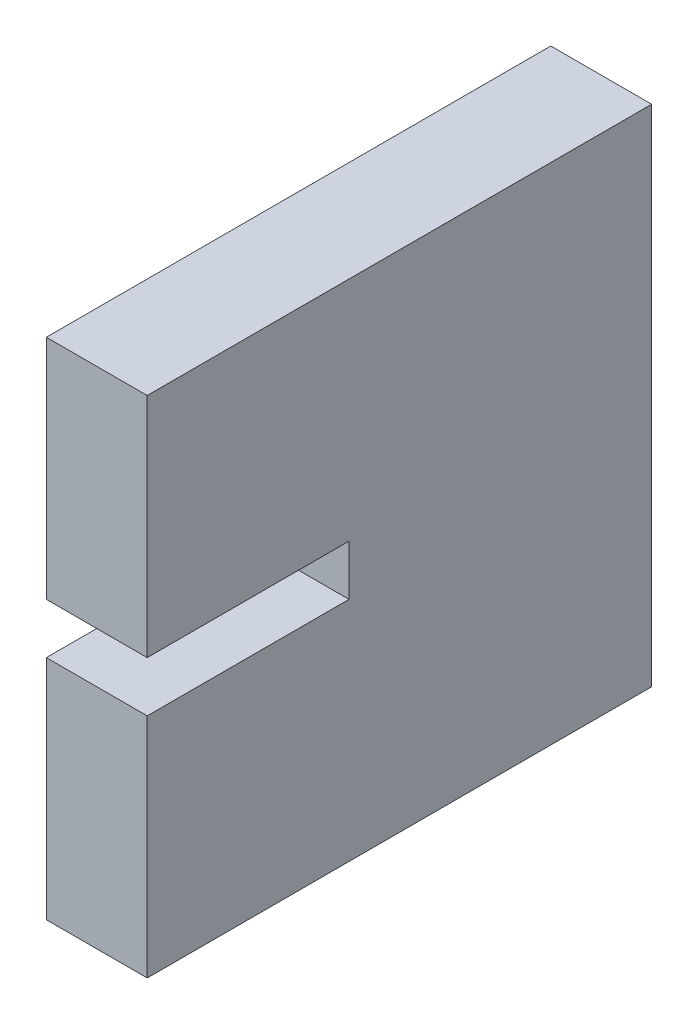
ISO-10303-21;
HEADER;
FILE_DESCRIPTION(('STEP AP214'),'2;1');
FILE_NAME('part.step','',(''),(''),'','','');
FILE_SCHEMA(('AUTOMOTIVE_DESIGN { 1 0 10303 214 1 1 1 1 }'));
ENDSEC;
DATA;
#1=APPLICATION_CONTEXT('core data for automotive mechanical design processes');
#2=APPLICATION_PROTOCOL_DEFINITION('international standard','automotive_design',2000,#1);
#3=PRODUCT_CONTEXT('',#1,'mechanical');
#4=PRODUCT('Part','Part','',(#3));
#5=PRODUCT_RELATED_PRODUCT_CATEGORY('part','',(#4));
#6=PRODUCT_DEFINITION_FORMATION('','',#4);
#7=PRODUCT_DEFINITION_CONTEXT('part definition',#1,'design');
#8=PRODUCT_DEFINITION('design','',#6,#7);
#9=PRODUCT_DEFINITION_SHAPE('','',#8);
#10=(LENGTH_UNIT() NAMED_UNIT(*) SI_UNIT(.MILLI.,.METRE.));
#11=(NAMED_UNIT(*) PLANE_ANGLE_UNIT() SI_UNIT($,.RADIAN.));
#12=(NAMED_UNIT(*) SI_UNIT($,.STERADIAN.) SOLID_ANGLE_UNIT());
#13=UNCERTAINTY_MEASURE_WITH_UNIT(LENGTH_MEASURE(1.E-05),#10,'distance_accuracy_value','');
#14=(GEOMETRIC_REPRESENTATION_CONTEXT(3) GLOBAL_UNCERTAINTY_ASSIGNED_CONTEXT((#13)) GLOBAL_UNIT_ASSIGNED_CONTEXT((#10,
#11,#12)) REPRESENTATION_CONTEXT('',''));
#15=CARTESIAN_POINT('',(0.,0.,0.));
#16=DIRECTION('',(0.,0.,1.));
#17=DIRECTION('',(1.,0.,0.));
#18=AXIS2_PLACEMENT_3D('',#15,#16,#17);
#19=CARTESIAN_POINT('',(20.,50.,50.));
#20=DIRECTION('',(0.,0.,-1.));
#21=DIRECTION('',(0.,1.,0.));
#22=AXIS2_PLACEMENT_3D('',#19,#20,#21);
#23=PLANE('',#22);
#24=DIRECTION('',(0.,-1.,0.));
#25=VECTOR('',#24,1.);
#26=CARTESIAN_POINT('',(0.,50.,50.));
#27=LINE('',#26,#25);
#28=CARTESIAN_POINT('',(0.,50.,50.));
#29=VERTEX_POINT('',#28);
#30=CARTESIAN_POINT('',(0.,5.,50.));
#31=VERTEX_POINT('',#30);
#32=EDGE_CURVE('E144',#29,#31,#27,.T.);
#33=ORIENTED_EDGE('',*,*,#32,.T.);
#34=DIRECTION('',(-1.,0.,0.));
#35=VECTOR('',#34,1.);
#36=CARTESIAN_POINT('',(20.,5.,50.));
#37=LINE('',#36,#35);
#38=CARTESIAN_POINT('',(20.,5.,50.));
#39=VERTEX_POINT('',#38);
#40=EDGE_CURVE('E11',#39,#31,#37,.T.);
#41=ORIENTED_EDGE('',*,*,#40,.F.);
#42=DIRECTION('',(0.,-1.,0.));
#43=VECTOR('',#42,1.);
#44=CARTESIAN_POINT('',(20.,50.,50.));
#45=LINE('',#44,#43);
#46=CARTESIAN_POINT('',(20.,50.,50.));
#47=VERTEX_POINT('',#46);
#48=EDGE_CURVE('E168',#47,#39,#45,.T.);
#49=ORIENTED_EDGE('',*,*,#48,.F.);
#50=DIRECTION('',(-1.,0.,0.));
#51=VECTOR('',#50,1.);
#52=CARTESIAN_POINT('',(20.,50.,50.));
#53=LINE('',#52,#51);
#54=EDGE_CURVE('E59',#47,#29,#53,.T.);
#55=ORIENTED_EDGE('',*,*,#54,.T.);
#56=EDGE_LOOP('',(#33,#41,#49,#55));
#57=FACE_BOUND('',#56,.T.);
#58=ADVANCED_FACE('F42',(#57),#23,.F.);
#59=CARTESIAN_POINT('',(20.,5.,50.));
#60=DIRECTION('',(0.,1.,0.));
#61=DIRECTION('',(0.,0.,1.));
#62=AXIS2_PLACEMENT_3D('',#59,#60,#61);
#63=PLANE('',#62);
#64=DIRECTION('',(0.,0.,-1.));
#65=VECTOR('',#64,1.);
#66=CARTESIAN_POINT('',(0.,5.,50.));
#67=LINE('',#66,#65);
#68=CARTESIAN_POINT('',(0.,5.,9.99999999999999));
#69=VERTEX_POINT('',#68);
#70=EDGE_CURVE('E147',#31,#69,#67,.T.);
#71=ORIENTED_EDGE('',*,*,#70,.T.);
#72=DIRECTION('',(-1.,0.,0.));
#73=VECTOR('',#72,1.);
#74=CARTESIAN_POINT('',(20.,5.,9.99999999999999));
#75=LINE('',#74,#73);
#76=CARTESIAN_POINT('',(20.,5.,9.99999999999999));
#77=VERTEX_POINT('',#76);
#78=EDGE_CURVE('E51',#77,#69,#75,.T.);
#79=ORIENTED_EDGE('',*,*,#78,.F.);
#80=DIRECTION('',(0.,0.,-1.));
#81=VECTOR('',#80,1.);
#82=CARTESIAN_POINT('',(20.,5.,50.));
#83=LINE('',#82,#81);
#84=EDGE_CURVE('E97',#39,#77,#83,.T.);
#85=ORIENTED_EDGE('',*,*,#84,.F.);
#86=ORIENTED_EDGE('',*,*,#40,.T.);
#87=EDGE_LOOP('',(#71,#79,#85,#86));
#88=FACE_BOUND('',#87,.T.);
#89=ADVANCED_FACE('F211',(#88),#63,.F.);
#90=CARTESIAN_POINT('',(20.,5.,9.99999999999999));
#91=DIRECTION('',(0.,0.,-1.));
#92=DIRECTION('',(-1.,0.,0.));
#93=AXIS2_PLACEMENT_3D('',#90,#91,#92);
#94=PLANE('',#93);
#95=DIRECTION('',(0.,-1.,0.));
#96=VECTOR('',#95,1.);
#97=CARTESIAN_POINT('',(0.,5.,9.99999999999999));
#98=LINE('',#97,#96);
#99=CARTESIAN_POINT('',(0.,-5.,9.99999999999999));
#100=VERTEX_POINT('',#99);
#101=EDGE_CURVE('E150',#69,#100,#98,.T.);
#102=ORIENTED_EDGE('',*,*,#101,.T.);
#103=DIRECTION('',(-1.,0.,0.));
#104=VECTOR('',#103,1.);
#105=CARTESIAN_POINT('',(20.,-5.,9.99999999999999));
#106=LINE('',#105,#104);
#107=CARTESIAN_POINT('',(20.,-5.,9.99999999999999));
#108=VERTEX_POINT('',#107);
#109=EDGE_CURVE('E179',#108,#100,#106,.T.);
#110=ORIENTED_EDGE('',*,*,#109,.F.);
#111=DIRECTION('',(0.,-1.,0.));
#112=VECTOR('',#111,1.);
#113=CARTESIAN_POINT('',(20.,5.,9.99999999999999));
#114=LINE('',#113,#112);
#115=EDGE_CURVE('E189',#77,#108,#114,.T.);
#116=ORIENTED_EDGE('',*,*,#115,.F.);
#117=ORIENTED_EDGE('',*,*,#78,.T.);
#118=EDGE_LOOP('',(#102,#110,#116,#117));
#119=FACE_BOUND('',#118,.T.);
#120=ADVANCED_FACE('F187',(#119),#94,.F.);
#121=CARTESIAN_POINT('',(20.,-5.,9.99999999999999));
#122=DIRECTION('',(0.,-1.,0.));
#123=DIRECTION('',(0.,0.,-1.));
#124=AXIS2_PLACEMENT_3D('',#121,#122,#123);
#125=PLANE('',#124);
#126=DIRECTION('',(0.,0.,1.));
#127=VECTOR('',#126,1.);
#128=CARTESIAN_POINT('',(0.,-5.,9.99999999999999));
#129=LINE('',#128,#127);
#130=CARTESIAN_POINT('',(0.,-5.,50.));
#131=VERTEX_POINT('',#130);
#132=EDGE_CURVE('E153',#100,#131,#129,.T.);
#133=ORIENTED_EDGE('',*,*,#132,.T.);
#134=DIRECTION('',(-1.,0.,0.));
#135=VECTOR('',#134,1.);
#136=CARTESIAN_POINT('',(20.,-5.,50.));
#137=LINE('',#136,#135);
#138=CARTESIAN_POINT('',(20.,-5.,50.));
#139=VERTEX_POINT('',#138);
#140=EDGE_CURVE('E175',#139,#131,#137,.T.);
#141=ORIENTED_EDGE('',*,*,#140,.F.);
#142=DIRECTION('',(0.,0.,1.));
#143=VECTOR('',#142,1.);
#144=CARTESIAN_POINT('',(20.,-5.,9.99999999999999));
#145=LINE('',#144,#143);
#146=EDGE_CURVE('E201',#108,#139,#145,.T.);
#147=ORIENTED_EDGE('',*,*,#146,.F.);
#148=ORIENTED_EDGE('',*,*,#109,.T.);
#149=EDGE_LOOP('',(#133,#141,#147,#148));
#150=FACE_BOUND('',#149,.T.);
#151=ADVANCED_FACE('F196',(#150),#125,.F.);
#152=CARTESIAN_POINT('',(20.,-5.,50.));
#153=DIRECTION('',(0.,0.,-1.));
#154=DIRECTION('',(-1.,0.,0.));
#155=AXIS2_PLACEMENT_3D('',#152,#153,#154);
#156=PLANE('',#155);
#157=DIRECTION('',(0.,-1.,0.));
#158=VECTOR('',#157,1.);
#159=CARTESIAN_POINT('',(0.,-5.,50.));
#160=LINE('',#159,#158);
#161=CARTESIAN_POINT('',(0.,-50.,50.));
#162=VERTEX_POINT('',#161);
#163=EDGE_CURVE('E156',#131,#162,#160,.T.);
#164=ORIENTED_EDGE('',*,*,#163,.T.);
#165=DIRECTION('',(-1.,0.,0.));
#166=VECTOR('',#165,1.);
#167=CARTESIAN_POINT('',(20.,-50.,50.));
#168=LINE('',#167,#166);
#169=CARTESIAN_POINT('',(20.,-50.,50.));
#170=VERTEX_POINT('',#169);
#171=EDGE_CURVE('E134',#170,#162,#168,.T.);
#172=ORIENTED_EDGE('',*,*,#171,.F.);
#173=DIRECTION('',(0.,-1.,0.));
#174=VECTOR('',#173,1.);
#175=CARTESIAN_POINT('',(20.,-5.,50.));
#176=LINE('',#175,#174);
#177=EDGE_CURVE('E120',#139,#170,#176,.T.);
#178=ORIENTED_EDGE('',*,*,#177,.F.);
#179=ORIENTED_EDGE('',*,*,#140,.T.);
#180=EDGE_LOOP('',(#164,#172,#178,#179));
#181=FACE_BOUND('',#180,.T.);
#182=ADVANCED_FACE('F199',(#181),#156,.F.);
#183=CARTESIAN_POINT('',(20.,-50.,50.));
#184=DIRECTION('',(0.,1.,0.));
#185=DIRECTION('',(0.,0.,1.));
#186=AXIS2_PLACEMENT_3D('',#183,#184,#185);
#187=PLANE('',#186);
#188=DIRECTION('',(0.,0.,-1.));
#189=VECTOR('',#188,1.);
#190=CARTESIAN_POINT('',(0.,-50.,50.));
#191=LINE('',#190,#189);
#192=CARTESIAN_POINT('',(0.,-50.,-50.));
#193=VERTEX_POINT('',#192);
#194=EDGE_CURVE('E130',#162,#193,#191,.T.);
#195=ORIENTED_EDGE('',*,*,#194,.T.);
#196=DIRECTION('',(-1.,0.,0.));
#197=VECTOR('',#196,1.);
#198=CARTESIAN_POINT('',(20.,-50.,-50.));
#199=LINE('',#198,#197);
#200=CARTESIAN_POINT('',(20.,-50.,-50.));
#201=VERTEX_POINT('',#200);
#202=EDGE_CURVE('E127',#201,#193,#199,.T.);
#203=ORIENTED_EDGE('',*,*,#202,.F.);
#204=DIRECTION('',(0.,0.,-1.));
#205=VECTOR('',#204,1.);
#206=CARTESIAN_POINT('',(20.,-50.,50.));
#207=LINE('',#206,#205);
#208=EDGE_CURVE('E113',#170,#201,#207,.T.);
#209=ORIENTED_EDGE('',*,*,#208,.F.);
#210=ORIENTED_EDGE('',*,*,#171,.T.);
#211=EDGE_LOOP('',(#195,#203,#209,#210));
#212=FACE_BOUND('',#211,.T.);
#213=ADVANCED_FACE('F128',(#212),#187,.F.);
#214=CARTESIAN_POINT('',(20.,50.,-50.));
#215=DIRECTION('',(0.,0.,-1.));
#216=DIRECTION('',(0.,1.,0.));
#217=AXIS2_PLACEMENT_3D('',#214,#215,#216);
#218=PLANE('',#217);
#219=DIRECTION('',(0.,-1.,0.));
#220=VECTOR('',#219,1.);
#221=CARTESIAN_POINT('',(0.,50.,-50.));
#222=LINE('',#221,#220);
#223=CARTESIAN_POINT('',(0.,50.,-50.));
#224=VERTEX_POINT('',#223);
#225=EDGE_CURVE('E161',#224,#193,#222,.T.);
#226=ORIENTED_EDGE('',*,*,#225,.F.);
#227=DIRECTION('',(-1.,0.,0.));
#228=VECTOR('',#227,1.);
#229=CARTESIAN_POINT('',(20.,50.,-50.));
#230=LINE('',#229,#228);
#231=CARTESIAN_POINT('',(20.,50.,-50.));
#232=VERTEX_POINT('',#231);
#233=EDGE_CURVE('E85',#232,#224,#230,.T.);
#234=ORIENTED_EDGE('',*,*,#233,.F.);
#235=DIRECTION('',(0.,-1.,0.));
#236=VECTOR('',#235,1.);
#237=CARTESIAN_POINT('',(20.,50.,-50.));
#238=LINE('',#237,#236);
#239=EDGE_CURVE('E118',#232,#201,#238,.T.);
#240=ORIENTED_EDGE('',*,*,#239,.T.);
#241=ORIENTED_EDGE('',*,*,#202,.T.);
#242=EDGE_LOOP('',(#226,#234,#240,#241));
#243=FACE_BOUND('',#242,.T.);
#244=ADVANCED_FACE('F136',(#243),#218,.T.);
#245=CARTESIAN_POINT('',(20.,50.,50.));
#246=DIRECTION('',(0.,1.,0.));
#247=DIRECTION('',(0.,0.,1.));
#248=AXIS2_PLACEMENT_3D('',#245,#246,#247);
#249=PLANE('',#248);
#250=DIRECTION('',(0.,0.,-1.));
#251=VECTOR('',#250,1.);
#252=CARTESIAN_POINT('',(0.,50.,50.));
#253=LINE('',#252,#251);
#254=EDGE_CURVE('E164',#29,#224,#253,.T.);
#255=ORIENTED_EDGE('',*,*,#254,.F.);
#256=ORIENTED_EDGE('',*,*,#54,.F.);
#257=DIRECTION('',(0.,0.,-1.));
#258=VECTOR('',#257,1.);
#259=CARTESIAN_POINT('',(20.,50.,50.));
#260=LINE('',#259,#258);
#261=EDGE_CURVE('E138',#47,#232,#260,.T.);
#262=ORIENTED_EDGE('',*,*,#261,.T.);
#263=ORIENTED_EDGE('',*,*,#233,.T.);
#264=EDGE_LOOP('',(#255,#256,#262,#263));
#265=FACE_BOUND('',#264,.T.);
#266=ADVANCED_FACE('F227',(#265),#249,.T.);
#267=CARTESIAN_POINT('',(20.,0.,0.));
#268=DIRECTION('',(1.,0.,0.));
#269=DIRECTION('',(0.,0.,-1.));
#270=AXIS2_PLACEMENT_3D('',#267,#268,#269);
#271=PLANE('',#270);
#272=ORIENTED_EDGE('',*,*,#48,.T.);
#273=ORIENTED_EDGE('',*,*,#84,.T.);
#274=ORIENTED_EDGE('',*,*,#115,.T.);
#275=ORIENTED_EDGE('',*,*,#146,.T.);
#276=ORIENTED_EDGE('',*,*,#177,.T.);
#277=ORIENTED_EDGE('',*,*,#208,.T.);
#278=ORIENTED_EDGE('',*,*,#239,.F.);
#279=ORIENTED_EDGE('',*,*,#261,.F.);
#280=EDGE_LOOP('',(#272,#273,#274,#275,#276,#277,#278,#279));
#281=FACE_BOUND('',#280,.T.);
#282=ADVANCED_FACE('F115',(#281),#271,.T.);
#283=CARTESIAN_POINT('',(0.,0.,0.));
#284=DIRECTION('',(1.,0.,0.));
#285=DIRECTION('',(0.,0.,-1.));
#286=AXIS2_PLACEMENT_3D('',#283,#284,#285);
#287=PLANE('',#286);
#288=ORIENTED_EDGE('',*,*,#32,.F.);
#289=ORIENTED_EDGE('',*,*,#254,.T.);
#290=ORIENTED_EDGE('',*,*,#225,.T.);
#291=ORIENTED_EDGE('',*,*,#194,.F.);
#292=ORIENTED_EDGE('',*,*,#163,.F.);
#293=ORIENTED_EDGE('',*,*,#132,.F.);
#294=ORIENTED_EDGE('',*,*,#101,.F.);
#295=ORIENTED_EDGE('',*,*,#70,.F.);
#296=EDGE_LOOP('',(#288,#289,#290,#291,#292,#293,#294,#295));
#297=FACE_BOUND('',#296,.T.);
#298=ADVANCED_FACE('F192',(#297),#287,.F.);
#299=CLOSED_SHELL('',(#58,#89,#120,#151,#182,#213,#244,#266,#282,#298));
#300=MANIFOLD_SOLID_BREP('B2',#299);
#301=ADVANCED_BREP_SHAPE_REPRESENTATION('',(#18,#300),#14);
#302=SHAPE_DEFINITION_REPRESENTATION(#9,#301);
ENDSEC;
END-ISO-10303-21;
